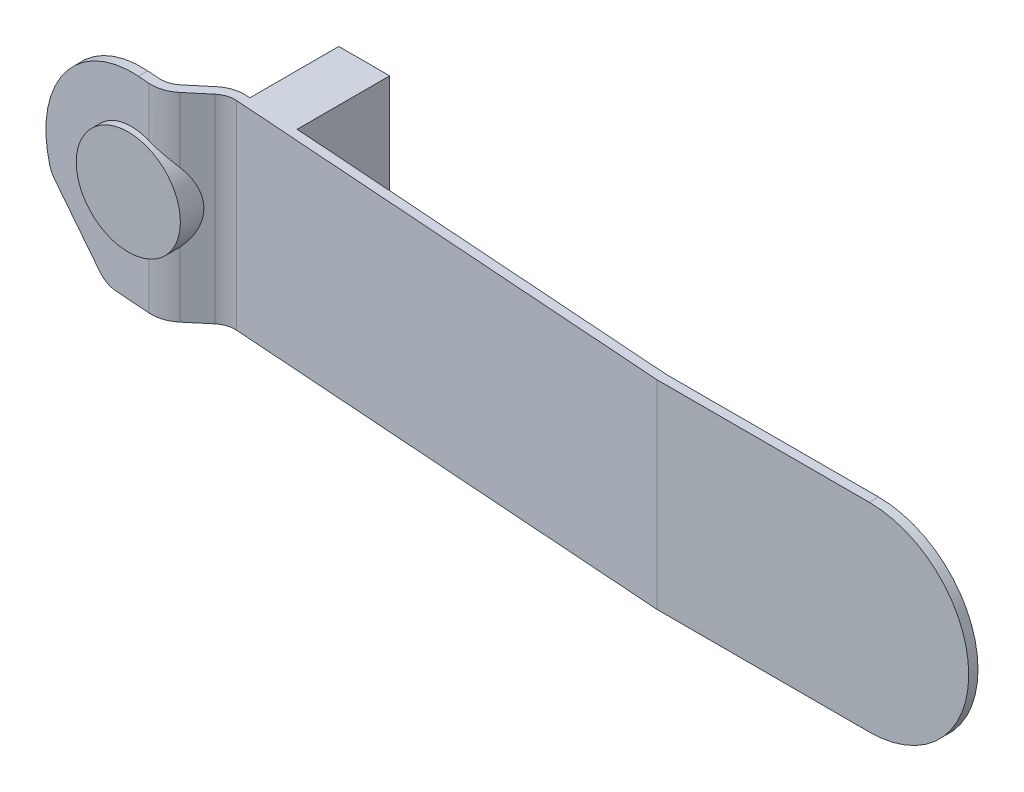
ISO-10303-21;
HEADER;
FILE_DESCRIPTION(('STEP AP214'),'2;1');
FILE_NAME('part.step','',(''),(''),'','','');
FILE_SCHEMA(('AUTOMOTIVE_DESIGN { 1 0 10303 214 1 1 1 1 }'));
ENDSEC;
DATA;
#1=APPLICATION_CONTEXT('core data for automotive mechanical design processes');
#2=APPLICATION_PROTOCOL_DEFINITION('international standard','automotive_design',2000,#1);
#3=PRODUCT_CONTEXT('',#1,'mechanical');
#4=PRODUCT('Part','Part','',(#3));
#5=PRODUCT_RELATED_PRODUCT_CATEGORY('part','',(#4));
#6=PRODUCT_DEFINITION_FORMATION('','',#4);
#7=PRODUCT_DEFINITION_CONTEXT('part definition',#1,'design');
#8=PRODUCT_DEFINITION('design','',#6,#7);
#9=PRODUCT_DEFINITION_SHAPE('','',#8);
#10=(LENGTH_UNIT() NAMED_UNIT(*) SI_UNIT(.MILLI.,.METRE.));
#11=(NAMED_UNIT(*) PLANE_ANGLE_UNIT() SI_UNIT($,.RADIAN.));
#12=(NAMED_UNIT(*) SI_UNIT($,.STERADIAN.) SOLID_ANGLE_UNIT());
#13=UNCERTAINTY_MEASURE_WITH_UNIT(LENGTH_MEASURE(1.E-05),#10,'distance_accuracy_value','');
#14=(GEOMETRIC_REPRESENTATION_CONTEXT(3) GLOBAL_UNCERTAINTY_ASSIGNED_CONTEXT((#13)) GLOBAL_UNIT_ASSIGNED_CONTEXT((#10,
#11,#12)) REPRESENTATION_CONTEXT('',''));
#15=CARTESIAN_POINT('',(0.,0.,0.));
#16=DIRECTION('',(0.,0.,1.));
#17=DIRECTION('',(1.,0.,0.));
#18=AXIS2_PLACEMENT_3D('',#15,#16,#17);
#19=CARTESIAN_POINT('',(-292.427876096865,42.1674612634088,44.6583194086939));
#20=DIRECTION('',(-0.642787609686544,0.,-0.766044443118974));
#21=DIRECTION('',(-0.766044443118974,0.,0.642787609686544));
#22=AXIS2_PLACEMENT_3D('',#19,#20,#21);
#23=PLANE('',#22);
#24=CARTESIAN_POINT('',(-317.5,-0.832538736591171,65.6963293286594));
#25=DIRECTION('',(-0.642787609686544,0.,-0.766044443118974));
#26=DIRECTION('',(-0.766044443118974,0.,0.642787609686544));
#27=AXIS2_PLACEMENT_3D('',#24,#25,#26);
#28=ELLIPSE('',#27,29.3716640099765,22.5);
#29=CARTESIAN_POINT('',(-300.666971367545,14.0972685983664,51.5717412115557));
#30=VERTEX_POINT('',#29);
#31=CARTESIAN_POINT('',(-300.666971367545,-15.7623460715487,51.5717412115557));
#32=VERTEX_POINT('',#31);
#33=EDGE_CURVE('E48',#30,#32,#28,.T.);
#34=ORIENTED_EDGE('',*,*,#33,.T.);
#35=DIRECTION('',(0.,-1.,0.));
#36=VECTOR('',#35,1.);
#37=CARTESIAN_POINT('',(-300.666971367545,42.1674612634088,51.5717412115557));
#38=LINE('',#37,#36);
#39=CARTESIAN_POINT('',(-300.666971367545,-43.8325387365912,51.5717412115557));
#40=VERTEX_POINT('',#39);
#41=EDGE_CURVE('E204',#32,#40,#38,.T.);
#42=ORIENTED_EDGE('',*,*,#41,.T.);
#43=DIRECTION('',(0.766044443118974,0.,-0.642787609686544));
#44=VECTOR('',#43,1.);
#45=CARTESIAN_POINT('',(-292.427876096865,-43.8325387365912,44.6583194086939));
#46=LINE('',#45,#44);
#47=CARTESIAN_POINT('',(-292.427876096865,-43.8325387365912,44.6583194086939));
#48=VERTEX_POINT('',#47);
#49=EDGE_CURVE('E247',#40,#48,#46,.T.);
#50=ORIENTED_EDGE('',*,*,#49,.T.);
#51=DIRECTION('',(0.,-1.,0.));
#52=VECTOR('',#51,1.);
#53=CARTESIAN_POINT('',(-292.427876096865,42.1674612634088,44.6583194086939));
#54=LINE('',#53,#52);
#55=CARTESIAN_POINT('',(-292.427876096865,42.1674612634088,44.6583194086939));
#56=VERTEX_POINT('',#55);
#57=EDGE_CURVE('E310',#56,#48,#54,.T.);
#58=ORIENTED_EDGE('',*,*,#57,.F.);
#59=DIRECTION('',(0.766044443118974,0.,-0.642787609686544));
#60=VECTOR('',#59,1.);
#61=CARTESIAN_POINT('',(-292.427876096865,42.1674612634088,44.6583194086939));
#62=LINE('',#61,#60);
#63=CARTESIAN_POINT('',(-300.666971367545,42.1674612634088,51.5717412115557));
#64=VERTEX_POINT('',#63);
#65=EDGE_CURVE('E293',#64,#56,#62,.T.);
#66=ORIENTED_EDGE('',*,*,#65,.F.);
#67=EDGE_CURVE('E199',#64,#30,#38,.T.);
#68=ORIENTED_EDGE('',*,*,#67,.T.);
#69=EDGE_LOOP('',(#34,#42,#50,#58,#66,#68));
#70=FACE_BOUND('',#69,.T.);
#71=ADVANCED_FACE('F33',(#70),#23,.F.);
#72=CARTESIAN_POINT('',(-309.665997903157,42.1674612634088,40.84711900789));
#73=DIRECTION('',(0.,-1.,0.));
#74=DIRECTION('',(0.,0.,-1.));
#75=AXIS2_PLACEMENT_3D('',#72,#73,#74);
#76=CYLINDRICAL_SURFACE('',#75,14.);
#77=CARTESIAN_POINT('',(-300.666971367545,-15.7623460715487,51.5717412115557));
#78=CARTESIAN_POINT('',(-300.843130198748,-15.9609562029234,51.7195437210844));
#79=CARTESIAN_POINT('',(-301.024032991783,-16.1578427404296,51.8639549479639));
#80=CARTESIAN_POINT('',(-301.39551720523,-16.547761317724,52.1455062025933));
#81=CARTESIAN_POINT('',(-301.58610111059,-16.7407923499866,52.2826443448365));
#82=CARTESIAN_POINT('',(-302.173384959975,-17.3141821176192,52.6828928260093));
#83=CARTESIAN_POINT('',(-302.5848393459,-17.6879550754872,52.9341788337272));
#84=CARTESIAN_POINT('',(-303.428848303456,-18.3979625568063,53.3897786317168));
#85=CARTESIAN_POINT('',(-303.859810588487,-18.7351121295305,53.5956127644671));
#86=CARTESIAN_POINT('',(-304.756438269486,-19.3840141816619,53.9669991464891));
#87=CARTESIAN_POINT('',(-305.222069415925,-19.6957911057345,54.1325904797659));
#88=CARTESIAN_POINT('',(-306.076076933374,-20.221588010671,54.3845906615122));
#89=CARTESIAN_POINT('',(-306.457932324087,-20.441712235296,54.4804430566163));
#90=CARTESIAN_POINT('',(-307.239076978159,-20.8615108500332,54.6409152475774));
#91=CARTESIAN_POINT('',(-307.638359479852,-21.0611930727241,54.7055470415177));
#92=CARTESIAN_POINT('',(-308.254749760054,-21.346655627733,54.7774135318072));
#93=CARTESIAN_POINT('',(-308.46659654449,-21.4408268552191,54.7972905723275));
#94=CARTESIAN_POINT('',(-308.893693579285,-21.6228089924467,54.8274393242549));
#95=CARTESIAN_POINT('',(-309.108943684046,-21.7106201733883,54.83771144545));
#96=CARTESIAN_POINT('',(-309.542665747188,-21.8797494977799,54.84825882259));
#97=CARTESIAN_POINT('',(-309.761142751474,-21.9610558247881,54.8485162801494));
#98=CARTESIAN_POINT('',(-310.200347773238,-22.1167936966438,54.8386447060616));
#99=CARTESIAN_POINT('',(-310.421076232742,-22.1912238614834,54.8285135944005));
#100=CARTESIAN_POINT('',(-310.642588535574,-22.2620956150608,54.8130157115275));
#101=B_SPLINE_CURVE_WITH_KNOTS('',3,(#77,#78,#79,#80,#81,#82,#83,#84,#85,#86,#87,#88,#89,#90,
#91,#92,#93,#94,#95,#96,#97,#98,#99,#100),.UNSPECIFIED.,.F.,.F.,(4,2,2,2,2,2,2,2,2,2,2,4),(0.,
0.911417847642028,1.8230708317527,3.65040754027295,5.40164542059695,7.151175631466,
8.50272515840325,9.85375487055663,10.551553078579,11.249321514107,11.9483299898059,
12.6474784492817),.UNSPECIFIED.);
#102=CARTESIAN_POINT('',(-310.642588535574,-22.2620956150616,54.8130157115275));
#103=VERTEX_POINT('',#102);
#104=EDGE_CURVE('E202',#32,#103,#101,.T.);
#105=ORIENTED_EDGE('',*,*,#104,.T.);
#106=DIRECTION('',(0.,-1.,0.));
#107=VECTOR('',#106,1.);
#108=CARTESIAN_POINT('',(-310.642588535574,42.1674612634088,54.8130157115275));
#109=LINE('',#108,#107);
#110=CARTESIAN_POINT('',(-310.642588535574,-43.8325387365912,54.8130157115275));
#111=VERTEX_POINT('',#110);
#112=EDGE_CURVE('E188',#103,#111,#109,.T.);
#113=ORIENTED_EDGE('',*,*,#112,.T.);
#114=CARTESIAN_POINT('',(-309.665997903157,-43.8325387365912,40.84711900789));
#115=DIRECTION('',(0.,1.,0.));
#116=DIRECTION('',(0.,0.,1.));
#117=AXIS2_PLACEMENT_3D('',#114,#115,#116);
#118=CIRCLE('',#117,14.);
#119=EDGE_CURVE('E245',#111,#40,#118,.T.);
#120=ORIENTED_EDGE('',*,*,#119,.T.);
#121=ORIENTED_EDGE('',*,*,#41,.F.);
#122=EDGE_LOOP('',(#105,#113,#120,#121));
#123=FACE_BOUND('',#122,.T.);
#124=ADVANCED_FACE('F203',(#123),#76,.T.);
#125=CARTESIAN_POINT('',(-310.642588535574,20.5970181418784,54.8130157115275));
#126=CARTESIAN_POINT('',(-310.447465579595,20.5345831152616,54.8266619643641));
#127=CARTESIAN_POINT('',(-310.252970334659,20.4694024039803,54.8361505617584));
#128=CARTESIAN_POINT('',(-309.865658069166,20.3336820729766,54.8470354363754));
#129=CARTESIAN_POINT('',(-309.672840825698,20.2631431775501,54.8484328053699));
#130=CARTESIAN_POINT('',(-309.098009184101,20.0438704289722,54.8408335036377));
#131=CARTESIAN_POINT('',(-308.719055324886,19.8873014642899,54.8200830865343));
#132=CARTESIAN_POINT('',(-307.976059201544,19.5563935955573,54.749715317119));
#133=CARTESIAN_POINT('',(-307.611912255943,19.382230310339,54.700363714833));
#134=CARTESIAN_POINT('',(-306.896996525218,19.0165809527136,54.5753505411615));
#135=CARTESIAN_POINT('',(-306.546231329414,18.8250902784662,54.4996819652025));
#136=CARTESIAN_POINT('',(-305.861586646091,18.4276085836541,54.324903711664));
#137=CARTESIAN_POINT('',(-305.527631300029,18.2216950965648,54.2259134916452));
#138=CARTESIAN_POINT('',(-304.875840232288,17.7962579259323,54.006626170799));
#139=CARTESIAN_POINT('',(-304.558004209217,17.5767344970341,53.8863294685421));
#140=CARTESIAN_POINT('',(-303.93821401289,17.1250624183375,53.6262339220639));
#141=CARTESIAN_POINT('',(-303.636309216278,16.8928785882503,53.48637884831));
#142=CARTESIAN_POINT('',(-303.049789849481,16.4180787892972,53.1894783228751));
#143=CARTESIAN_POINT('',(-302.765173198322,16.1754640820232,53.0324349465504));
#144=CARTESIAN_POINT('',(-302.160264125346,15.6337130666234,52.6712778447218));
#145=CARTESIAN_POINT('',(-301.843611045043,15.3326668573083,52.4639153166906));
#146=CARTESIAN_POINT('',(-301.387842042949,14.8739741756968,52.1390063694827));
#147=CARTESIAN_POINT('',(-301.239466057726,14.7202802685378,52.0286838777245));
#148=CARTESIAN_POINT('',(-300.948726003644,14.4105065877141,51.8035304040181));
#149=CARTESIAN_POINT('',(-300.806362225186,14.2544266992968,51.6886992048065));
#150=CARTESIAN_POINT('',(-300.666971367545,14.0972685983664,51.5717412115557));
#151=B_SPLINE_CURVE_WITH_KNOTS('',3,(#125,#126,#127,#128,#129,#130,#131,#132,#133,#134,#135,
#136,#137,#138,#139,#140,#141,#142,#143,#144,#145,#146,#147,#148,#149,#150),.UNSPECIFIED.,.F.,
.F.,(4,2,2,2,2,2,2,2,2,2,2,2,4),(0.,0.615835604992478,1.23158811165521,2.46133422806015,
3.67983320093103,4.8986567402189,6.11136801269973,7.32405660194074,8.54030617476556,
9.75640905640295,11.2059538157439,11.9271489362477,12.648378852095),.UNSPECIFIED.);
#152=CARTESIAN_POINT('',(-310.642588535574,20.5970181418793,54.8130157115275));
#153=VERTEX_POINT('',#152);
#154=EDGE_CURVE('E56',#153,#30,#151,.T.);
#155=ORIENTED_EDGE('',*,*,#154,.T.);
#156=ORIENTED_EDGE('',*,*,#67,.F.);
#157=CARTESIAN_POINT('',(-309.665997903157,42.1674612634088,40.84711900789));
#158=DIRECTION('',(0.,1.,0.));
#159=DIRECTION('',(0.,0.,1.));
#160=AXIS2_PLACEMENT_3D('',#157,#158,#159);
#161=CIRCLE('',#160,14.);
#162=CARTESIAN_POINT('',(-310.642588535574,42.1674612634088,54.8130157115275));
#163=VERTEX_POINT('',#162);
#164=EDGE_CURVE('E290',#163,#64,#161,.T.);
#165=ORIENTED_EDGE('',*,*,#164,.F.);
#166=EDGE_CURVE('E198',#163,#153,#109,.T.);
#167=ORIENTED_EDGE('',*,*,#166,.T.);
#168=EDGE_LOOP('',(#155,#156,#165,#167));
#169=FACE_BOUND('',#168,.T.);
#170=ADVANCED_FACE('F482',(#169),#76,.T.);
#171=CARTESIAN_POINT('',(-310.642588535574,42.1674612634088,54.8130157115275));
#172=DIRECTION('',(0.0697564737441253,0.,-0.997564050259824));
#173=DIRECTION('',(-0.997564050259824,0.,-0.0697564737441253));
#174=AXIS2_PLACEMENT_3D('',#171,#172,#173);
#175=PLANE('',#174);
#176=CARTESIAN_POINT('',(-317.5,-0.832538736591171,54.3334987896742));
#177=DIRECTION('',(0.0697564737441253,0.,-0.997564050259824));
#178=DIRECTION('',(0.997564050259824,0.,0.0697564737441253));
#179=AXIS2_PLACEMENT_3D('',#176,#177,#178);
#180=ELLIPSE('',#179,22.5549427068264,22.5);
#181=EDGE_CURVE('E192',#103,#153,#180,.T.);
#182=ORIENTED_EDGE('',*,*,#181,.T.);
#183=ORIENTED_EDGE('',*,*,#166,.F.);
#184=DIRECTION('',(0.997564050259824,0.,0.0697564737441253));
#185=VECTOR('',#184,1.);
#186=CARTESIAN_POINT('',(-310.642588535574,42.1674612634088,54.8130157115275));
#187=LINE('',#186,#185);
#188=CARTESIAN_POINT('',(-315.668414779499,42.1674612634088,54.4615757049078));
#189=VERTEX_POINT('',#188);
#190=EDGE_CURVE('E287',#189,#163,#187,.T.);
#191=ORIENTED_EDGE('',*,*,#190,.F.);
#192=CARTESIAN_POINT('',(-315.668414779499,-0.832538736591171,54.4615757049078));
#193=DIRECTION('',(0.0697564737441253,0.,-0.997564050259824));
#194=DIRECTION('',(-0.997564050259824,0.,-0.0697564737441253));
#195=AXIS2_PLACEMENT_3D('',#192,#193,#194);
#196=ELLIPSE('',#195,43.1050016174904,43.);
#197=CARTESIAN_POINT('',(-356.779010365793,-13.4388439264648,51.5868428184594));
#198=VERTEX_POINT('',#197);
#199=EDGE_CURVE('E345',#198,#189,#196,.T.);
#200=ORIENTED_EDGE('',*,*,#199,.F.);
#201=CARTESIAN_POINT('',(-347.218406741073,-10.5071450450988,52.2553853501916));
#202=DIRECTION('',(0.0697564737441253,0.,-0.997564050259824));
#203=DIRECTION('',(-0.997564050259824,0.,-0.0697564737441253));
#204=AXIS2_PLACEMENT_3D('',#201,#202,#203);
#205=ELLIPSE('',#204,10.0244189808117,10.);
#206=CARTESIAN_POINT('',(-354.649854995847,-17.1984511086874,51.7357278656121));
#207=VERTEX_POINT('',#206);
#208=EDGE_CURVE('E342',#207,#198,#205,.T.);
#209=ORIENTED_EDGE('',*,*,#208,.F.);
#210=DIRECTION('',(-0.668399336363226,0.742332667868515,-0.0467390346970385));
#211=VECTOR('',#210,1.);
#212=CARTESIAN_POINT('',(-354.391676326386,-17.4851875700528,51.7537814768793));
#213=LINE('',#212,#211);
#214=CARTESIAN_POINT('',(-333.647576181188,-40.5238448001798,53.2043502666699));
#215=VERTEX_POINT('',#214);
#216=EDGE_CURVE('E339',#215,#207,#213,.T.);
#217=ORIENTED_EDGE('',*,*,#216,.F.);
#218=CARTESIAN_POINT('',(-326.216127926414,-33.8325387365912,53.7240077512494));
#219=DIRECTION('',(0.0697564737441253,0.,-0.997564050259824));
#220=DIRECTION('',(-0.997564050259824,0.,-0.0697564737441253));
#221=AXIS2_PLACEMENT_3D('',#218,#219,#220);
#222=ELLIPSE('',#221,10.0244189808117,9.99999999999999);
#223=CARTESIAN_POINT('',(-326.216127926414,-43.8325387365912,53.7240077512494));
#224=VERTEX_POINT('',#223);
#225=EDGE_CURVE('E336',#224,#215,#222,.T.);
#226=ORIENTED_EDGE('',*,*,#225,.F.);
#227=DIRECTION('',(-0.997564050259824,0.,-0.0697564737441253));
#228=VECTOR('',#227,1.);
#229=CARTESIAN_POINT('',(0.67204097501515,-43.8325387365912,76.5822552645781));
#230=LINE('',#229,#228);
#231=EDGE_CURVE('E194',#111,#224,#230,.T.);
#232=ORIENTED_EDGE('',*,*,#231,.F.);
#233=ORIENTED_EDGE('',*,*,#112,.F.);
#234=EDGE_LOOP('',(#182,#183,#191,#200,#209,#217,#226,#232,#233));
#235=FACE_BOUND('',#234,.T.);
#236=ADVANCED_FACE('F190',(#235),#175,.F.);
#237=CARTESIAN_POINT('',(50.,42.1674612634088,52.));
#238=DIRECTION('',(0.,0.,1.));
#239=DIRECTION('',(1.,0.,0.));
#240=AXIS2_PLACEMENT_3D('',#237,#238,#239);
#241=PLANE('',#240);
#242=CARTESIAN_POINT('',(1.83158522050059,-0.832538736591171,52.));
#243=DIRECTION('',(0.,0.,1.));
#244=DIRECTION('',(1.,0.,0.));
#245=AXIS2_PLACEMENT_3D('',#242,#243,#244);
#246=CIRCLE('',#245,43.);
#247=CARTESIAN_POINT('',(1.83158522050059,-43.8325387365912,52.));
#248=VERTEX_POINT('',#247);
#249=CARTESIAN_POINT('',(1.83158522050058,42.1674612634088,52.));
#250=VERTEX_POINT('',#249);
#251=EDGE_CURVE('E360',#248,#250,#246,.T.);
#252=ORIENTED_EDGE('',*,*,#251,.F.);
#253=DIRECTION('',(1.,0.,0.));
#254=VECTOR('',#253,1.);
#255=CARTESIAN_POINT('',(1.83158522050059,-43.8325387365912,52.));
#256=LINE('',#255,#254);
#257=CARTESIAN_POINT('',(-89.860316922033,-43.8325387365912,52.));
#258=VERTEX_POINT('',#257);
#259=EDGE_CURVE('E41',#258,#248,#256,.T.);
#260=ORIENTED_EDGE('',*,*,#259,.F.);
#261=DIRECTION('',(0.,-1.,0.));
#262=VECTOR('',#261,1.);
#263=CARTESIAN_POINT('',(-89.860316922033,42.1674612634088,52.));
#264=LINE('',#263,#262);
#265=CARTESIAN_POINT('',(-89.860316922033,42.1674612634088,52.));
#266=VERTEX_POINT('',#265);
#267=EDGE_CURVE('E330',#266,#258,#264,.T.);
#268=ORIENTED_EDGE('',*,*,#267,.F.);
#269=DIRECTION('',(-1.,0.,0.));
#270=VECTOR('',#269,1.);
#271=CARTESIAN_POINT('',(50.,42.1674612634088,52.));
#272=LINE('',#271,#270);
#273=EDGE_CURVE('E257',#250,#266,#272,.T.);
#274=ORIENTED_EDGE('',*,*,#273,.F.);
#275=EDGE_LOOP('',(#252,#260,#268,#274));
#276=FACE_BOUND('',#275,.T.);
#277=CARTESIAN_POINT('',(0.,0.,52.));
#278=DIRECTION('',(0.,0.,1.));
#279=DIRECTION('',(1.,0.,0.));
#280=AXIS2_PLACEMENT_3D('',#277,#278,#279);
#281=CIRCLE('',#280,20.);
#282=CARTESIAN_POINT('',(20.,0.,52.));
#283=VERTEX_POINT('',#282);
#284=EDGE_CURVE('E11',#283,#283,#281,.F.);
#285=ORIENTED_EDGE('',*,*,#284,.F.);
#286=EDGE_LOOP('',(#285));
#287=FACE_BOUND('',#286,.T.);
#288=ADVANCED_FACE('F456',(#276,#287),#241,.F.);
#289=CARTESIAN_POINT('',(1.83158522050059,-0.832538736591171,60.));
#290=DIRECTION('',(0.,0.,-1.));
#291=DIRECTION('',(-1.,0.,0.));
#292=AXIS2_PLACEMENT_3D('',#289,#290,#291);
#293=CYLINDRICAL_SURFACE('',#292,43.);
#294=DIRECTION('',(0.,0.,-1.));
#295=VECTOR('',#294,1.);
#296=CARTESIAN_POINT('',(1.83158522050059,-43.8325387365912,60.));
#297=LINE('',#296,#295);
#298=CARTESIAN_POINT('',(1.83158522050059,-43.8325387365912,56.));
#299=VERTEX_POINT('',#298);
#300=EDGE_CURVE('E363',#299,#248,#297,.T.);
#301=ORIENTED_EDGE('',*,*,#300,.T.);
#302=ORIENTED_EDGE('',*,*,#251,.T.);
#303=DIRECTION('',(0.,0.,-1.));
#304=VECTOR('',#303,1.);
#305=CARTESIAN_POINT('',(1.83158522050058,42.1674612634088,60.));
#306=LINE('',#305,#304);
#307=CARTESIAN_POINT('',(1.83158522050058,42.1674612634088,56.));
#308=VERTEX_POINT('',#307);
#309=EDGE_CURVE('E381',#308,#250,#306,.T.);
#310=ORIENTED_EDGE('',*,*,#309,.F.);
#311=CARTESIAN_POINT('',(1.83158522050059,-0.832538736591171,56.));
#312=DIRECTION('',(0.,0.,-1.));
#313=DIRECTION('',(-1.,0.,0.));
#314=AXIS2_PLACEMENT_3D('',#311,#312,#313);
#315=CIRCLE('',#314,43.);
#316=EDGE_CURVE('E333',#308,#299,#315,.T.);
#317=ORIENTED_EDGE('',*,*,#316,.T.);
#318=EDGE_LOOP('',(#301,#302,#310,#317));
#319=FACE_BOUND('',#318,.T.);
#320=ADVANCED_FACE('F35',(#319),#293,.T.);
#321=CARTESIAN_POINT('',(1.83158522050058,42.1674612634088,60.));
#322=DIRECTION('',(0.,-1.,0.));
#323=DIRECTION('',(1.,0.,0.));
#324=AXIS2_PLACEMENT_3D('',#321,#322,#323);
#325=PLANE('',#324);
#326=ORIENTED_EDGE('',*,*,#309,.T.);
#327=ORIENTED_EDGE('',*,*,#273,.T.);
#328=DIRECTION('',(-0.997564050259824,0.,-0.0697564737441253));
#329=VECTOR('',#328,1.);
#330=CARTESIAN_POINT('',(-89.860316922033,42.1674612634088,52.));
#331=LINE('',#330,#329);
#332=CARTESIAN_POINT('',(-261.5,42.1674612634088,39.9977841593633));
#333=VERTEX_POINT('',#332);
#334=EDGE_CURVE('E260',#266,#333,#331,.T.);
#335=ORIENTED_EDGE('',*,*,#334,.T.);
#336=DIRECTION('',(0.,0.,-1.));
#337=VECTOR('',#336,1.);
#338=CARTESIAN_POINT('',(-261.5,42.1674612634088,0.));
#339=LINE('',#338,#337);
#340=CARTESIAN_POINT('',(-261.5,42.1674612634088,0.));
#341=VERTEX_POINT('',#340);
#342=EDGE_CURVE('E263',#333,#341,#339,.T.);
#343=ORIENTED_EDGE('',*,*,#342,.T.);
#344=DIRECTION('',(-1.,0.,0.));
#345=VECTOR('',#344,1.);
#346=CARTESIAN_POINT('',(-283.5,42.1674612634088,0.));
#347=LINE('',#346,#345);
#348=CARTESIAN_POINT('',(-283.5,42.1674612634088,0.));
#349=VERTEX_POINT('',#348);
#350=EDGE_CURVE('E266',#341,#349,#347,.T.);
#351=ORIENTED_EDGE('',*,*,#350,.T.);
#352=DIRECTION('',(0.,0.,1.));
#353=VECTOR('',#352,1.);
#354=CARTESIAN_POINT('',(-283.5,42.1674612634088,38.459394296606));
#355=LINE('',#354,#353);
#356=CARTESIAN_POINT('',(-283.5,42.1674612634088,38.459394296606));
#357=VERTEX_POINT('',#356);
#358=EDGE_CURVE('E269',#349,#357,#355,.T.);
#359=ORIENTED_EDGE('',*,*,#358,.T.);
#360=DIRECTION('',(-0.997564050259824,0.,-0.0697564737441274));
#361=VECTOR('',#360,1.);
#362=CARTESIAN_POINT('',(-285.023409367582,42.1674612634088,38.3528671362461));
#363=LINE('',#362,#361);
#364=CARTESIAN_POINT('',(-285.023409367582,42.1674612634088,38.3528671362461));
#365=VERTEX_POINT('',#364);
#366=EDGE_CURVE('E272',#357,#365,#363,.T.);
#367=ORIENTED_EDGE('',*,*,#366,.T.);
#368=CARTESIAN_POINT('',(-286.,42.1674612634088,52.3187638398837));
#369=DIRECTION('',(0.,1.,0.));
#370=DIRECTION('',(0.,0.,-1.));
#371=AXIS2_PLACEMENT_3D('',#368,#369,#370);
#372=CIRCLE('',#371,14.);
#373=CARTESIAN_POINT('',(-294.999026535612,42.1674612634088,41.594141636218));
#374=VERTEX_POINT('',#373);
#375=EDGE_CURVE('E275',#365,#374,#372,.T.);
#376=ORIENTED_EDGE('',*,*,#375,.T.);
#377=DIRECTION('',(-0.766044443118976,0.,0.642787609686541));
#378=VECTOR('',#377,1.);
#379=CARTESIAN_POINT('',(-294.999026535612,42.1674612634088,41.594141636218));
#380=LINE('',#379,#378);
#381=CARTESIAN_POINT('',(-303.238121806291,42.1674612634088,48.5075634390797));
#382=VERTEX_POINT('',#381);
#383=EDGE_CURVE('E278',#374,#382,#380,.T.);
#384=ORIENTED_EDGE('',*,*,#383,.T.);
#385=CARTESIAN_POINT('',(-309.665997903157,42.1674612634088,40.84711900789));
#386=DIRECTION('',(0.,-1.,0.));
#387=DIRECTION('',(0.,0.,1.));
#388=AXIS2_PLACEMENT_3D('',#385,#386,#387);
#389=CIRCLE('',#388,10.);
#390=CARTESIAN_POINT('',(-310.363562640598,42.1674612634088,50.8227595104882));
#391=VERTEX_POINT('',#390);
#392=EDGE_CURVE('E281',#382,#391,#389,.T.);
#393=ORIENTED_EDGE('',*,*,#392,.T.);
#394=DIRECTION('',(-0.997564050259824,0.,-0.0697564737441254));
#395=VECTOR('',#394,1.);
#396=CARTESIAN_POINT('',(-310.363562640598,42.1674612634088,50.8227595104882));
#397=LINE('',#396,#395);
#398=CARTESIAN_POINT('',(-315.668414779499,42.1674612634088,50.4518081125831));
#399=VERTEX_POINT('',#398);
#400=EDGE_CURVE('E284',#391,#399,#397,.T.);
#401=ORIENTED_EDGE('',*,*,#400,.T.);
#402=DIRECTION('',(0.,0.,-1.));
#403=VECTOR('',#402,1.);
#404=CARTESIAN_POINT('',(-315.668414779499,42.1674612634088,60.));
#405=LINE('',#404,#403);
#406=EDGE_CURVE('E378',#189,#399,#405,.T.);
#407=ORIENTED_EDGE('',*,*,#406,.F.);
#408=ORIENTED_EDGE('',*,*,#190,.T.);
#409=ORIENTED_EDGE('',*,*,#164,.T.);
#410=ORIENTED_EDGE('',*,*,#65,.T.);
#411=CARTESIAN_POINT('',(-286.,42.1674612634088,52.3187638398837));
#412=DIRECTION('',(0.,-1.,0.));
#413=DIRECTION('',(0.,0.,-1.));
#414=AXIS2_PLACEMENT_3D('',#411,#412,#413);
#415=CIRCLE('',#414,10.);
#416=CARTESIAN_POINT('',(-285.302435262559,42.1674612634088,42.3431233372854));
#417=VERTEX_POINT('',#416);
#418=EDGE_CURVE('E296',#56,#417,#415,.T.);
#419=ORIENTED_EDGE('',*,*,#418,.T.);
#420=DIRECTION('',(0.997564050259824,0.,0.0697564737441253));
#421=VECTOR('',#420,1.);
#422=CARTESIAN_POINT('',(-90.,42.1674612634088,56.));
#423=LINE('',#422,#421);
#424=CARTESIAN_POINT('',(-90.,42.1674612634088,56.));
#425=VERTEX_POINT('',#424);
#426=EDGE_CURVE('E299',#417,#425,#423,.T.);
#427=ORIENTED_EDGE('',*,*,#426,.T.);
#428=DIRECTION('',(1.,0.,0.));
#429=VECTOR('',#428,1.);
#430=CARTESIAN_POINT('',(50.,42.1674612634088,56.));
#431=LINE('',#430,#429);
#432=EDGE_CURVE('E302',#425,#308,#431,.T.);
#433=ORIENTED_EDGE('',*,*,#432,.T.);
#434=EDGE_LOOP('',(#326,#327,#335,#343,#351,#359,#367,#376,#384,#393,#401,#407,#408,#409,#410,
#419,#427,#433));
#435=FACE_BOUND('',#434,.T.);
#436=ADVANCED_FACE('F398',(#435),#325,.F.);
#437=CARTESIAN_POINT('',(-315.668414779499,-0.832538736591171,60.));
#438=DIRECTION('',(0.,0.,-1.));
#439=DIRECTION('',(-1.,0.,0.));
#440=AXIS2_PLACEMENT_3D('',#437,#438,#439);
#441=CYLINDRICAL_SURFACE('',#440,43.);
#442=ORIENTED_EDGE('',*,*,#406,.T.);
#443=CARTESIAN_POINT('',(-315.668414779499,-0.832538736591171,50.4518081125831));
#444=DIRECTION('',(-0.0697564737441254,0.,0.997564050259824));
#445=DIRECTION('',(-0.997564050259824,0.,-0.0697564737441254));
#446=AXIS2_PLACEMENT_3D('',#443,#444,#445);
#447=ELLIPSE('',#446,43.1050016174904,43.);
#448=CARTESIAN_POINT('',(-356.779010365793,-13.4388439264648,47.5770752261347));
#449=VERTEX_POINT('',#448);
#450=EDGE_CURVE('E357',#399,#449,#447,.T.);
#451=ORIENTED_EDGE('',*,*,#450,.T.);
#452=DIRECTION('',(0.,0.,-1.));
#453=VECTOR('',#452,1.);
#454=CARTESIAN_POINT('',(-356.779010365793,-13.4388439264648,60.));
#455=LINE('',#454,#453);
#456=EDGE_CURVE('E375',#198,#449,#455,.T.);
#457=ORIENTED_EDGE('',*,*,#456,.F.);
#458=ORIENTED_EDGE('',*,*,#199,.T.);
#459=EDGE_LOOP('',(#442,#451,#457,#458));
#460=FACE_BOUND('',#459,.T.);
#461=ADVANCED_FACE('F424',(#460),#441,.T.);
#462=CARTESIAN_POINT('',(-347.218406741073,-10.5071450450988,60.));
#463=DIRECTION('',(0.,0.,-1.));
#464=DIRECTION('',(-1.,0.,0.));
#465=AXIS2_PLACEMENT_3D('',#462,#463,#464);
#466=CYLINDRICAL_SURFACE('',#465,10.);
#467=ORIENTED_EDGE('',*,*,#456,.T.);
#468=CARTESIAN_POINT('',(-347.218406741073,-10.5071450450988,48.2456177578669));
#469=DIRECTION('',(-0.0697564737441254,0.,0.997564050259824));
#470=DIRECTION('',(-0.997564050259824,0.,-0.0697564737441254));
#471=AXIS2_PLACEMENT_3D('',#468,#469,#470);
#472=ELLIPSE('',#471,10.0244189808117,10.);
#473=CARTESIAN_POINT('',(-354.649854995847,-17.1984511086874,47.7259602732874));
#474=VERTEX_POINT('',#473);
#475=EDGE_CURVE('E354',#449,#474,#472,.T.);
#476=ORIENTED_EDGE('',*,*,#475,.T.);
#477=DIRECTION('',(0.,0.,-1.));
#478=VECTOR('',#477,1.);
#479=CARTESIAN_POINT('',(-354.649854995847,-17.1984511086874,60.));
#480=LINE('',#479,#478);
#481=EDGE_CURVE('E372',#207,#474,#480,.T.);
#482=ORIENTED_EDGE('',*,*,#481,.F.);
#483=ORIENTED_EDGE('',*,*,#208,.T.);
#484=EDGE_LOOP('',(#467,#476,#482,#483));
#485=FACE_BOUND('',#484,.T.);
#486=ADVANCED_FACE('F420',(#485),#466,.T.);
#487=CARTESIAN_POINT('',(-354.649854995847,-17.1984511086874,60.));
#488=DIRECTION('',(0.743144825477389,0.669130606358864,0.));
#489=DIRECTION('',(-0.669130606358864,0.743144825477389,0.));
#490=AXIS2_PLACEMENT_3D('',#487,#488,#489);
#491=PLANE('',#490);
#492=ORIENTED_EDGE('',*,*,#481,.T.);
#493=DIRECTION('',(0.668399336363226,-0.742332667868515,0.0467390346970386));
#494=VECTOR('',#493,1.);
#495=CARTESIAN_POINT('',(-354.266409824388,-17.6243101148607,47.7527733716826));
#496=LINE('',#495,#494);
#497=CARTESIAN_POINT('',(-333.647576181188,-40.5238448001798,49.1945826743452));
#498=VERTEX_POINT('',#497);
#499=EDGE_CURVE('E351',#474,#498,#496,.T.);
#500=ORIENTED_EDGE('',*,*,#499,.T.);
#501=DIRECTION('',(0.,0.,-1.));
#502=VECTOR('',#501,1.);
#503=CARTESIAN_POINT('',(-333.647576181188,-40.5238448001798,60.));
#504=LINE('',#503,#502);
#505=EDGE_CURVE('E369',#215,#498,#504,.T.);
#506=ORIENTED_EDGE('',*,*,#505,.F.);
#507=ORIENTED_EDGE('',*,*,#216,.T.);
#508=EDGE_LOOP('',(#492,#500,#506,#507));
#509=FACE_BOUND('',#508,.T.);
#510=ADVANCED_FACE('F417',(#509),#491,.F.);
#511=CARTESIAN_POINT('',(-326.216127926414,-33.8325387365912,60.));
#512=DIRECTION('',(0.,0.,-1.));
#513=DIRECTION('',(-1.,0.,0.));
#514=AXIS2_PLACEMENT_3D('',#511,#512,#513);
#515=CYLINDRICAL_SURFACE('',#514,9.99999999999999);
#516=ORIENTED_EDGE('',*,*,#505,.T.);
#517=CARTESIAN_POINT('',(-326.216127926414,-33.8325387365912,49.7142401589247));
#518=DIRECTION('',(-0.0697564737441254,0.,0.997564050259824));
#519=DIRECTION('',(-0.997564050259824,0.,-0.0697564737441254));
#520=AXIS2_PLACEMENT_3D('',#517,#518,#519);
#521=ELLIPSE('',#520,10.0244189808117,9.99999999999999);
#522=CARTESIAN_POINT('',(-326.216127926414,-43.8325387365912,49.7142401589247));
#523=VERTEX_POINT('',#522);
#524=EDGE_CURVE('E348',#498,#523,#521,.T.);
#525=ORIENTED_EDGE('',*,*,#524,.T.);
#526=DIRECTION('',(0.,0.,-1.));
#527=VECTOR('',#526,1.);
#528=CARTESIAN_POINT('',(-326.216127926414,-43.8325387365912,60.));
#529=LINE('',#528,#527);
#530=EDGE_CURVE('E366',#224,#523,#529,.T.);
#531=ORIENTED_EDGE('',*,*,#530,.F.);
#532=ORIENTED_EDGE('',*,*,#225,.T.);
#533=EDGE_LOOP('',(#516,#525,#531,#532));
#534=FACE_BOUND('',#533,.T.);
#535=ADVANCED_FACE('F412',(#534),#515,.T.);
#536=CARTESIAN_POINT('',(1.83158522050059,-43.8325387365912,60.));
#537=DIRECTION('',(0.,1.,0.));
#538=DIRECTION('',(-1.,0.,0.));
#539=AXIS2_PLACEMENT_3D('',#536,#537,#538);
#540=PLANE('',#539);
#541=DIRECTION('',(-0.997564050259824,0.,-0.0697564737441253));
#542=VECTOR('',#541,1.);
#543=CARTESIAN_POINT('',(-89.860316922033,-43.8325387365912,52.));
#544=LINE('',#543,#542);
#545=CARTESIAN_POINT('',(-261.5,-43.8325387365912,39.9977841593633));
#546=VERTEX_POINT('',#545);
#547=EDGE_CURVE('E219',#258,#546,#544,.T.);
#548=ORIENTED_EDGE('',*,*,#547,.F.);
#549=ORIENTED_EDGE('',*,*,#259,.T.);
#550=ORIENTED_EDGE('',*,*,#300,.F.);
#551=DIRECTION('',(1.,0.,0.));
#552=VECTOR('',#551,1.);
#553=CARTESIAN_POINT('',(50.,-43.8325387365912,56.));
#554=LINE('',#553,#552);
#555=CARTESIAN_POINT('',(-90.,-43.8325387365912,56.));
#556=VERTEX_POINT('',#555);
#557=EDGE_CURVE('E255',#556,#299,#554,.T.);
#558=ORIENTED_EDGE('',*,*,#557,.F.);
#559=DIRECTION('',(0.997564050259824,0.,0.0697564737441253));
#560=VECTOR('',#559,1.);
#561=CARTESIAN_POINT('',(-90.,-43.8325387365912,56.));
#562=LINE('',#561,#560);
#563=CARTESIAN_POINT('',(-285.302435262559,-43.8325387365912,42.3431233372854));
#564=VERTEX_POINT('',#563);
#565=EDGE_CURVE('E253',#564,#556,#562,.T.);
#566=ORIENTED_EDGE('',*,*,#565,.F.);
#567=CARTESIAN_POINT('',(-286.,-43.8325387365912,52.3187638398837));
#568=DIRECTION('',(0.,-1.,0.));
#569=DIRECTION('',(0.,0.,-1.));
#570=AXIS2_PLACEMENT_3D('',#567,#568,#569);
#571=CIRCLE('',#570,10.);
#572=EDGE_CURVE('E250',#48,#564,#571,.T.);
#573=ORIENTED_EDGE('',*,*,#572,.F.);
#574=ORIENTED_EDGE('',*,*,#49,.F.);
#575=ORIENTED_EDGE('',*,*,#119,.F.);
#576=ORIENTED_EDGE('',*,*,#231,.T.);
#577=ORIENTED_EDGE('',*,*,#530,.T.);
#578=DIRECTION('',(-0.997564050259824,0.,-0.0697564737441254));
#579=VECTOR('',#578,1.);
#580=CARTESIAN_POINT('',(-310.363562640598,-43.8325387365912,50.8227595104882));
#581=LINE('',#580,#579);
#582=CARTESIAN_POINT('',(-310.363562640598,-43.8325387365912,50.8227595104882));
#583=VERTEX_POINT('',#582);
#584=EDGE_CURVE('E243',#583,#523,#581,.T.);
#585=ORIENTED_EDGE('',*,*,#584,.F.);
#586=CARTESIAN_POINT('',(-309.665997903157,-43.8325387365912,40.84711900789));
#587=DIRECTION('',(0.,-1.,0.));
#588=DIRECTION('',(0.,0.,1.));
#589=AXIS2_PLACEMENT_3D('',#586,#587,#588);
#590=CIRCLE('',#589,10.);
#591=CARTESIAN_POINT('',(-303.238121806291,-43.8325387365912,48.5075634390797));
#592=VERTEX_POINT('',#591);
#593=EDGE_CURVE('E241',#592,#583,#590,.T.);
#594=ORIENTED_EDGE('',*,*,#593,.F.);
#595=DIRECTION('',(-0.766044443118976,0.,0.642787609686541));
#596=VECTOR('',#595,1.);
#597=CARTESIAN_POINT('',(-294.999026535612,-43.8325387365912,41.594141636218));
#598=LINE('',#597,#596);
#599=CARTESIAN_POINT('',(-294.999026535612,-43.8325387365912,41.594141636218));
#600=VERTEX_POINT('',#599);
#601=EDGE_CURVE('E238',#600,#592,#598,.T.);
#602=ORIENTED_EDGE('',*,*,#601,.F.);
#603=CARTESIAN_POINT('',(-286.,-43.8325387365912,52.3187638398837));
#604=DIRECTION('',(0.,1.,0.));
#605=DIRECTION('',(0.,0.,-1.));
#606=AXIS2_PLACEMENT_3D('',#603,#604,#605);
#607=CIRCLE('',#606,14.);
#608=CARTESIAN_POINT('',(-285.023409367582,-43.8325387365912,38.3528671362461));
#609=VERTEX_POINT('',#608);
#610=EDGE_CURVE('E235',#609,#600,#607,.T.);
#611=ORIENTED_EDGE('',*,*,#610,.F.);
#612=DIRECTION('',(-0.997564050259824,0.,-0.0697564737441274));
#613=VECTOR('',#612,1.);
#614=CARTESIAN_POINT('',(-285.023409367582,-43.8325387365912,38.3528671362461));
#615=LINE('',#614,#613);
#616=CARTESIAN_POINT('',(-283.5,-43.8325387365912,38.459394296606));
#617=VERTEX_POINT('',#616);
#618=EDGE_CURVE('E232',#617,#609,#615,.T.);
#619=ORIENTED_EDGE('',*,*,#618,.F.);
#620=DIRECTION('',(0.,0.,1.));
#621=VECTOR('',#620,1.);
#622=CARTESIAN_POINT('',(-283.5,-43.8325387365912,38.459394296606));
#623=LINE('',#622,#621);
#624=CARTESIAN_POINT('',(-283.5,-43.8325387365912,0.));
#625=VERTEX_POINT('',#624);
#626=EDGE_CURVE('E229',#625,#617,#623,.T.);
#627=ORIENTED_EDGE('',*,*,#626,.F.);
#628=DIRECTION('',(-1.,0.,0.));
#629=VECTOR('',#628,1.);
#630=CARTESIAN_POINT('',(-283.5,-43.8325387365912,0.));
#631=LINE('',#630,#629);
#632=CARTESIAN_POINT('',(-261.5,-43.8325387365912,0.));
#633=VERTEX_POINT('',#632);
#634=EDGE_CURVE('E226',#633,#625,#631,.T.);
#635=ORIENTED_EDGE('',*,*,#634,.F.);
#636=DIRECTION('',(0.,0.,-1.));
#637=VECTOR('',#636,1.);
#638=CARTESIAN_POINT('',(-261.5,-43.8325387365912,0.));
#639=LINE('',#638,#637);
#640=EDGE_CURVE('E223',#546,#633,#639,.T.);
#641=ORIENTED_EDGE('',*,*,#640,.F.);
#642=EDGE_LOOP('',(#548,#549,#550,#558,#566,#573,#574,#575,#576,#577,#585,#594,#602,#611,#619,
#627,#635,#641));
#643=FACE_BOUND('',#642,.T.);
#644=ADVANCED_FACE('F388',(#643),#540,.F.);
#645=CARTESIAN_POINT('',(50.,42.1674612634088,56.));
#646=DIRECTION('',(0.,0.,-1.));
#647=DIRECTION('',(-1.,0.,0.));
#648=AXIS2_PLACEMENT_3D('',#645,#646,#647);
#649=PLANE('',#648);
#650=ORIENTED_EDGE('',*,*,#316,.F.);
#651=ORIENTED_EDGE('',*,*,#432,.F.);
#652=DIRECTION('',(0.,-1.,0.));
#653=VECTOR('',#652,1.);
#654=CARTESIAN_POINT('',(-90.,42.1674612634088,56.));
#655=LINE('',#654,#653);
#656=EDGE_CURVE('E305',#425,#556,#655,.T.);
#657=ORIENTED_EDGE('',*,*,#656,.T.);
#658=ORIENTED_EDGE('',*,*,#557,.T.);
#659=EDGE_LOOP('',(#650,#651,#657,#658));
#660=FACE_BOUND('',#659,.T.);
#661=ADVANCED_FACE('F396',(#660),#649,.F.);
#662=CARTESIAN_POINT('',(-90.,42.1674612634088,56.));
#663=DIRECTION('',(0.0697564737441253,0.,-0.997564050259824));
#664=DIRECTION('',(-0.997564050259824,0.,-0.0697564737441253));
#665=AXIS2_PLACEMENT_3D('',#662,#663,#664);
#666=PLANE('',#665);
#667=DIRECTION('',(0.,-1.,0.));
#668=VECTOR('',#667,1.);
#669=CARTESIAN_POINT('',(-285.302435262559,42.1674612634088,42.3431233372854));
#670=LINE('',#669,#668);
#671=EDGE_CURVE('E308',#417,#564,#670,.T.);
#672=ORIENTED_EDGE('',*,*,#671,.T.);
#673=ORIENTED_EDGE('',*,*,#565,.T.);
#674=ORIENTED_EDGE('',*,*,#656,.F.);
#675=ORIENTED_EDGE('',*,*,#426,.F.);
#676=EDGE_LOOP('',(#672,#673,#674,#675));
#677=FACE_BOUND('',#676,.T.);
#678=ADVANCED_FACE('F402',(#677),#666,.F.);
#679=CARTESIAN_POINT('',(-286.,42.1674612634088,52.3187638398837));
#680=DIRECTION('',(0.,-1.,0.));
#681=DIRECTION('',(0.,0.,-1.));
#682=AXIS2_PLACEMENT_3D('',#679,#680,#681);
#683=CYLINDRICAL_SURFACE('',#682,10.);
#684=ORIENTED_EDGE('',*,*,#57,.T.);
#685=ORIENTED_EDGE('',*,*,#572,.T.);
#686=ORIENTED_EDGE('',*,*,#671,.F.);
#687=ORIENTED_EDGE('',*,*,#418,.F.);
#688=EDGE_LOOP('',(#684,#685,#686,#687));
#689=FACE_BOUND('',#688,.T.);
#690=ADVANCED_FACE('F407',(#689),#683,.F.);
#691=CARTESIAN_POINT('',(-310.363562640598,42.1674612634088,50.8227595104882));
#692=DIRECTION('',(-0.0697564737441254,0.,0.997564050259824));
#693=DIRECTION('',(0.997564050259824,0.,0.0697564737441254));
#694=AXIS2_PLACEMENT_3D('',#691,#692,#693);
#695=PLANE('',#694);
#696=ORIENTED_EDGE('',*,*,#450,.F.);
#697=ORIENTED_EDGE('',*,*,#400,.F.);
#698=DIRECTION('',(0.,-1.,0.));
#699=VECTOR('',#698,1.);
#700=CARTESIAN_POINT('',(-310.363562640598,42.1674612634088,50.8227595104882));
#701=LINE('',#700,#699);
#702=EDGE_CURVE('E313',#391,#583,#701,.T.);
#703=ORIENTED_EDGE('',*,*,#702,.T.);
#704=ORIENTED_EDGE('',*,*,#584,.T.);
#705=ORIENTED_EDGE('',*,*,#524,.F.);
#706=ORIENTED_EDGE('',*,*,#499,.F.);
#707=ORIENTED_EDGE('',*,*,#475,.F.);
#708=EDGE_LOOP('',(#696,#697,#703,#704,#705,#706,#707));
#709=FACE_BOUND('',#708,.T.);
#710=ADVANCED_FACE('F415',(#709),#695,.F.);
#711=CARTESIAN_POINT('',(-89.860316922033,42.1674612634088,52.));
#712=DIRECTION('',(-0.0697564737441253,0.,0.997564050259824));
#713=DIRECTION('',(0.997564050259824,0.,0.0697564737441253));
#714=AXIS2_PLACEMENT_3D('',#711,#712,#713);
#715=PLANE('',#714);
#716=ORIENTED_EDGE('',*,*,#267,.T.);
#717=ORIENTED_EDGE('',*,*,#547,.T.);
#718=DIRECTION('',(0.,-1.,0.));
#719=VECTOR('',#718,1.);
#720=CARTESIAN_POINT('',(-261.5,42.1674612634088,39.9977841593633));
#721=LINE('',#720,#719);
#722=EDGE_CURVE('E328',#333,#546,#721,.T.);
#723=ORIENTED_EDGE('',*,*,#722,.F.);
#724=ORIENTED_EDGE('',*,*,#334,.F.);
#725=EDGE_LOOP('',(#716,#717,#723,#724));
#726=FACE_BOUND('',#725,.T.);
#727=ADVANCED_FACE('F455',(#726),#715,.F.);
#728=CARTESIAN_POINT('',(-261.5,42.1674612634088,0.));
#729=DIRECTION('',(-1.,0.,0.));
#730=DIRECTION('',(0.,0.,1.));
#731=AXIS2_PLACEMENT_3D('',#728,#729,#730);
#732=PLANE('',#731);
#733=ORIENTED_EDGE('',*,*,#722,.T.);
#734=ORIENTED_EDGE('',*,*,#640,.T.);
#735=DIRECTION('',(0.,-1.,0.));
#736=VECTOR('',#735,1.);
#737=CARTESIAN_POINT('',(-261.5,42.1674612634088,0.));
#738=LINE('',#737,#736);
#739=EDGE_CURVE('E326',#341,#633,#738,.T.);
#740=ORIENTED_EDGE('',*,*,#739,.F.);
#741=ORIENTED_EDGE('',*,*,#342,.F.);
#742=EDGE_LOOP('',(#733,#734,#740,#741));
#743=FACE_BOUND('',#742,.T.);
#744=ADVANCED_FACE('F451',(#743),#732,.F.);
#745=CARTESIAN_POINT('',(-283.5,42.1674612634088,0.));
#746=DIRECTION('',(0.,0.,1.));
#747=DIRECTION('',(1.,0.,0.));
#748=AXIS2_PLACEMENT_3D('',#745,#746,#747);
#749=PLANE('',#748);
#750=ORIENTED_EDGE('',*,*,#739,.T.);
#751=ORIENTED_EDGE('',*,*,#634,.T.);
#752=DIRECTION('',(0.,-1.,0.));
#753=VECTOR('',#752,1.);
#754=CARTESIAN_POINT('',(-283.5,42.1674612634088,0.));
#755=LINE('',#754,#753);
#756=EDGE_CURVE('E324',#349,#625,#755,.T.);
#757=ORIENTED_EDGE('',*,*,#756,.F.);
#758=ORIENTED_EDGE('',*,*,#350,.F.);
#759=EDGE_LOOP('',(#750,#751,#757,#758));
#760=FACE_BOUND('',#759,.T.);
#761=ADVANCED_FACE('F449',(#760),#749,.F.);
#762=CARTESIAN_POINT('',(-283.5,42.1674612634088,38.459394296606));
#763=DIRECTION('',(1.,0.,0.));
#764=DIRECTION('',(0.,0.,-1.));
#765=AXIS2_PLACEMENT_3D('',#762,#763,#764);
#766=PLANE('',#765);
#767=ORIENTED_EDGE('',*,*,#756,.T.);
#768=ORIENTED_EDGE('',*,*,#626,.T.);
#769=DIRECTION('',(0.,-1.,0.));
#770=VECTOR('',#769,1.);
#771=CARTESIAN_POINT('',(-283.5,42.1674612634088,38.459394296606));
#772=LINE('',#771,#770);
#773=EDGE_CURVE('E322',#357,#617,#772,.T.);
#774=ORIENTED_EDGE('',*,*,#773,.F.);
#775=ORIENTED_EDGE('',*,*,#358,.F.);
#776=EDGE_LOOP('',(#767,#768,#774,#775));
#777=FACE_BOUND('',#776,.T.);
#778=ADVANCED_FACE('F446',(#777),#766,.F.);
#779=CARTESIAN_POINT('',(-285.023409367582,42.1674612634088,38.3528671362461));
#780=DIRECTION('',(-0.0697564737441274,0.,0.997564050259824));
#781=DIRECTION('',(0.997564050259824,0.,0.0697564737441274));
#782=AXIS2_PLACEMENT_3D('',#779,#780,#781);
#783=PLANE('',#782);
#784=ORIENTED_EDGE('',*,*,#773,.T.);
#785=ORIENTED_EDGE('',*,*,#618,.T.);
#786=DIRECTION('',(0.,-1.,0.));
#787=VECTOR('',#786,1.);
#788=CARTESIAN_POINT('',(-285.023409367582,42.1674612634088,38.3528671362461));
#789=LINE('',#788,#787);
#790=EDGE_CURVE('E320',#365,#609,#789,.T.);
#791=ORIENTED_EDGE('',*,*,#790,.F.);
#792=ORIENTED_EDGE('',*,*,#366,.F.);
#793=EDGE_LOOP('',(#784,#785,#791,#792));
#794=FACE_BOUND('',#793,.T.);
#795=ADVANCED_FACE('F442',(#794),#783,.F.);
#796=CARTESIAN_POINT('',(-286.,42.1674612634088,52.3187638398837));
#797=DIRECTION('',(0.,-1.,0.));
#798=DIRECTION('',(0.,0.,-1.));
#799=AXIS2_PLACEMENT_3D('',#796,#797,#798);
#800=CYLINDRICAL_SURFACE('',#799,14.);
#801=ORIENTED_EDGE('',*,*,#790,.T.);
#802=ORIENTED_EDGE('',*,*,#610,.T.);
#803=DIRECTION('',(0.,-1.,0.));
#804=VECTOR('',#803,1.);
#805=CARTESIAN_POINT('',(-294.999026535612,42.1674612634088,41.594141636218));
#806=LINE('',#805,#804);
#807=EDGE_CURVE('E318',#374,#600,#806,.T.);
#808=ORIENTED_EDGE('',*,*,#807,.F.);
#809=ORIENTED_EDGE('',*,*,#375,.F.);
#810=EDGE_LOOP('',(#801,#802,#808,#809));
#811=FACE_BOUND('',#810,.T.);
#812=ADVANCED_FACE('F437',(#811),#800,.T.);
#813=CARTESIAN_POINT('',(-294.999026535612,42.1674612634088,41.594141636218));
#814=DIRECTION('',(0.642787609686541,0.,0.766044443118976));
#815=DIRECTION('',(0.766044443118976,0.,-0.642787609686541));
#816=AXIS2_PLACEMENT_3D('',#813,#814,#815);
#817=PLANE('',#816);
#818=ORIENTED_EDGE('',*,*,#807,.T.);
#819=ORIENTED_EDGE('',*,*,#601,.T.);
#820=DIRECTION('',(0.,-1.,0.));
#821=VECTOR('',#820,1.);
#822=CARTESIAN_POINT('',(-303.238121806291,42.1674612634088,48.5075634390797));
#823=LINE('',#822,#821);
#824=EDGE_CURVE('E316',#382,#592,#823,.T.);
#825=ORIENTED_EDGE('',*,*,#824,.F.);
#826=ORIENTED_EDGE('',*,*,#383,.F.);
#827=EDGE_LOOP('',(#818,#819,#825,#826));
#828=FACE_BOUND('',#827,.T.);
#829=ADVANCED_FACE('F434',(#828),#817,.F.);
#830=CARTESIAN_POINT('',(-309.665997903157,42.1674612634088,40.84711900789));
#831=DIRECTION('',(0.,-1.,0.));
#832=DIRECTION('',(0.,0.,-1.));
#833=AXIS2_PLACEMENT_3D('',#830,#831,#832);
#834=CYLINDRICAL_SURFACE('',#833,10.);
#835=ORIENTED_EDGE('',*,*,#824,.T.);
#836=ORIENTED_EDGE('',*,*,#593,.T.);
#837=ORIENTED_EDGE('',*,*,#702,.F.);
#838=ORIENTED_EDGE('',*,*,#392,.F.);
#839=EDGE_LOOP('',(#835,#836,#837,#838));
#840=FACE_BOUND('',#839,.T.);
#841=ADVANCED_FACE('F431',(#840),#834,.F.);
#842=CARTESIAN_POINT('',(0.,0.,52.));
#843=DIRECTION('',(0.,0.,1.));
#844=DIRECTION('',(-1.,0.,0.));
#845=AXIS2_PLACEMENT_3D('',#842,#843,#844);
#846=CONICAL_SURFACE('',#845,20.,0.0174532925199433);
#847=CARTESIAN_POINT('',(0.,0.,40.));
#848=DIRECTION('',(0.,0.,-1.));
#849=DIRECTION('',(-1.,0.,0.));
#850=AXIS2_PLACEMENT_3D('',#847,#848,#849);
#851=CIRCLE('',#850,19.7905392208614);
#852=CARTESIAN_POINT('',(-19.7905392208614,0.,40.));
#853=VERTEX_POINT('',#852);
#854=EDGE_CURVE('E216',#853,#853,#851,.T.);
#855=ORIENTED_EDGE('',*,*,#854,.F.);
#856=EDGE_LOOP('',(#855));
#857=FACE_BOUND('',#856,.T.);
#858=ORIENTED_EDGE('',*,*,#284,.T.);
#859=EDGE_LOOP('',(#858));
#860=FACE_BOUND('',#859,.T.);
#861=ADVANCED_FACE('F462',(#857,#860),#846,.T.);
#862=CARTESIAN_POINT('',(0.,0.,40.));
#863=DIRECTION('',(0.,0.,-1.));
#864=DIRECTION('',(-1.,0.,0.));
#865=AXIS2_PLACEMENT_3D('',#862,#863,#864);
#866=PLANE('',#865);
#867=ORIENTED_EDGE('',*,*,#854,.T.);
#868=EDGE_LOOP('',(#867));
#869=FACE_BOUND('',#868,.T.);
#870=ADVANCED_FACE('F464',(#869),#866,.T.);
#871=CARTESIAN_POINT('',(-317.500000000071,-0.832538736591171,-500000.));
#872=DIRECTION('',(0.,0.,1.));
#873=DIRECTION('',(1.,0.,0.));
#874=AXIS2_PLACEMENT_3D('',#871,#872,#873);
#875=CYLINDRICAL_SURFACE('',#874,22.5);
#876=CARTESIAN_POINT('',(-317.5,-0.832538736591171,57.));
#877=DIRECTION('',(0.,0.,-1.));
#878=DIRECTION('',(-1.,0.,0.));
#879=AXIS2_PLACEMENT_3D('',#876,#877,#878);
#880=CIRCLE('',#879,22.5);
#881=CARTESIAN_POINT('',(-340.,-0.832538736591171,57.));
#882=VERTEX_POINT('',#881);
#883=EDGE_CURVE('E220',#882,#882,#880,.T.);
#884=ORIENTED_EDGE('',*,*,#883,.T.);
#885=EDGE_LOOP('',(#884));
#886=FACE_BOUND('',#885,.T.);
#887=ORIENTED_EDGE('',*,*,#33,.F.);
#888=ORIENTED_EDGE('',*,*,#154,.F.);
#889=ORIENTED_EDGE('',*,*,#181,.F.);
#890=ORIENTED_EDGE('',*,*,#104,.F.);
#891=EDGE_LOOP('',(#887,#888,#889,#890));
#892=FACE_BOUND('',#891,.T.);
#893=ADVANCED_FACE('F207',(#886,#892),#875,.T.);
#894=CARTESIAN_POINT('',(-317.5,-0.832538736591171,57.));
#895=DIRECTION('',(0.,0.,-1.));
#896=DIRECTION('',(-1.,0.,0.));
#897=AXIS2_PLACEMENT_3D('',#894,#895,#896);
#898=PLANE('',#897);
#899=ORIENTED_EDGE('',*,*,#883,.F.);
#900=EDGE_LOOP('',(#899));
#901=FACE_BOUND('',#900,.T.);
#902=ADVANCED_FACE('F473',(#901),#898,.F.);
#903=CLOSED_SHELL('',(#71,#124,#170,#236,#288,#320,#436,#461,#486,#510,#535,#644,#661,#678,#690,
#710,#727,#744,#761,#778,#795,#812,#829,#841,#861,#870,#893,#902));
#904=MANIFOLD_SOLID_BREP('B2',#903);
#905=ADVANCED_BREP_SHAPE_REPRESENTATION('',(#18,#904),#14);
#906=SHAPE_DEFINITION_REPRESENTATION(#9,#905);
ENDSEC;
END-ISO-10303-21;
